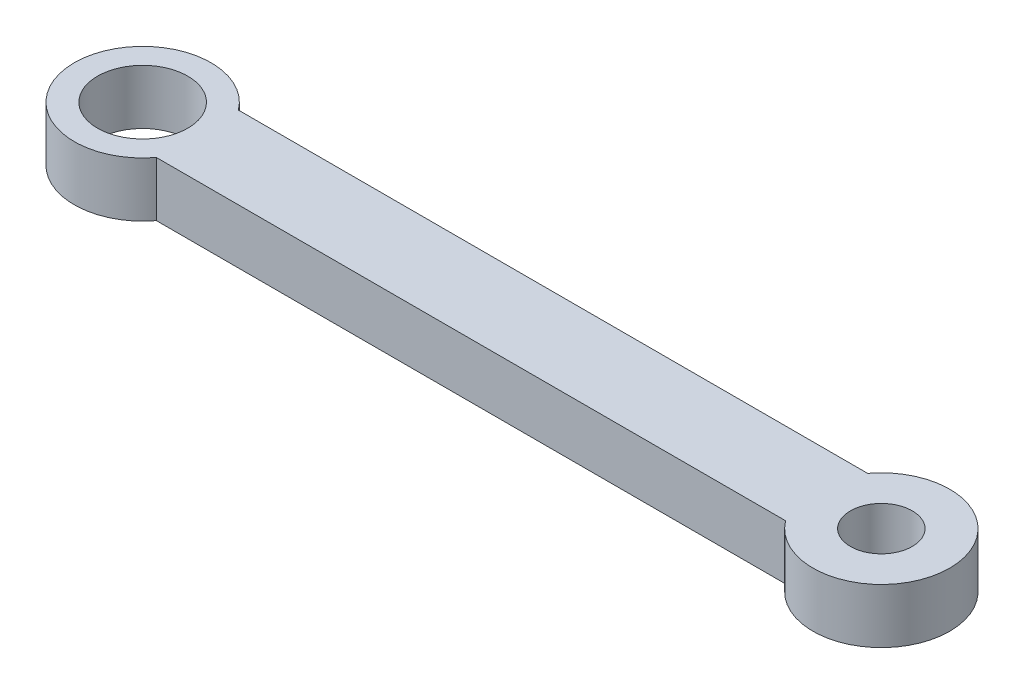
ISO-10303-21;
HEADER;
FILE_DESCRIPTION(('STEP AP214'),'2;1');
FILE_NAME('part.step','',(''),(''),'','','');
FILE_SCHEMA(('AUTOMOTIVE_DESIGN { 1 0 10303 214 1 1 1 1 }'));
ENDSEC;
DATA;
#1=APPLICATION_CONTEXT('core data for automotive mechanical design processes');
#2=APPLICATION_PROTOCOL_DEFINITION('international standard','automotive_design',2000,#1);
#3=PRODUCT_CONTEXT('',#1,'mechanical');
#4=PRODUCT('Part','Part','',(#3));
#5=PRODUCT_RELATED_PRODUCT_CATEGORY('part','',(#4));
#6=PRODUCT_DEFINITION_FORMATION('','',#4);
#7=PRODUCT_DEFINITION_CONTEXT('part definition',#1,'design');
#8=PRODUCT_DEFINITION('design','',#6,#7);
#9=PRODUCT_DEFINITION_SHAPE('','',#8);
#10=(LENGTH_UNIT() NAMED_UNIT(*) SI_UNIT(.MILLI.,.METRE.));
#11=(NAMED_UNIT(*) PLANE_ANGLE_UNIT() SI_UNIT($,.RADIAN.));
#12=(NAMED_UNIT(*) SI_UNIT($,.STERADIAN.) SOLID_ANGLE_UNIT());
#13=UNCERTAINTY_MEASURE_WITH_UNIT(LENGTH_MEASURE(1.E-05),#10,'distance_accuracy_value','');
#14=(GEOMETRIC_REPRESENTATION_CONTEXT(3) GLOBAL_UNCERTAINTY_ASSIGNED_CONTEXT((#13)) GLOBAL_UNIT_ASSIGNED_CONTEXT((#10,
#11,#12)) REPRESENTATION_CONTEXT('',''));
#15=CARTESIAN_POINT('',(0.,0.,0.));
#16=DIRECTION('',(0.,0.,1.));
#17=DIRECTION('',(1.,0.,0.));
#18=AXIS2_PLACEMENT_3D('',#15,#16,#17);
#19=CARTESIAN_POINT('',(-13.5,2.,0.));
#20=DIRECTION('',(0.,1.,0.));
#21=DIRECTION('',(0.,0.,1.));
#22=AXIS2_PLACEMENT_3D('',#19,#20,#21);
#23=PLANE('',#22);
#24=CARTESIAN_POINT('',(-13.5,2.,0.));
#25=DIRECTION('',(0.,1.,0.));
#26=DIRECTION('',(0.,0.,1.));
#27=AXIS2_PLACEMENT_3D('',#24,#25,#26);
#28=CIRCLE('',#27,1.65);
#29=CARTESIAN_POINT('',(-13.5,2.,1.65));
#30=VERTEX_POINT('',#29);
#31=EDGE_CURVE('E100',#30,#30,#28,.T.);
#32=ORIENTED_EDGE('',*,*,#31,.F.);
#33=EDGE_LOOP('',(#32));
#34=FACE_BOUND('',#33,.T.);
#35=CARTESIAN_POINT('',(-13.5,2.,0.));
#36=DIRECTION('',(0.,1.,0.));
#37=DIRECTION('',(0.,0.,1.));
#38=AXIS2_PLACEMENT_3D('',#35,#36,#37);
#39=CIRCLE('',#38,2.5);
#40=CARTESIAN_POINT('',(-11.5,2.,-1.5));
#41=VERTEX_POINT('',#40);
#42=CARTESIAN_POINT('',(-11.5,2.,1.5));
#43=VERTEX_POINT('',#42);
#44=EDGE_CURVE('E85',#41,#43,#39,.T.);
#45=ORIENTED_EDGE('',*,*,#44,.T.);
#46=DIRECTION('',(1.,0.,0.));
#47=VECTOR('',#46,1.);
#48=CARTESIAN_POINT('',(-11.5,2.,1.5));
#49=LINE('',#48,#47);
#50=CARTESIAN_POINT('',(11.5,2.,1.5));
#51=VERTEX_POINT('',#50);
#52=EDGE_CURVE('E80',#43,#51,#49,.T.);
#53=ORIENTED_EDGE('',*,*,#52,.T.);
#54=CARTESIAN_POINT('',(13.5,2.,0.));
#55=DIRECTION('',(0.,1.,0.));
#56=DIRECTION('',(0.,0.,-1.));
#57=AXIS2_PLACEMENT_3D('',#54,#55,#56);
#58=CIRCLE('',#57,2.5);
#59=CARTESIAN_POINT('',(11.5,2.,-1.50000000000001));
#60=VERTEX_POINT('',#59);
#61=EDGE_CURVE('E83',#51,#60,#58,.T.);
#62=ORIENTED_EDGE('',*,*,#61,.T.);
#63=DIRECTION('',(-1.,0.,0.));
#64=VECTOR('',#63,1.);
#65=CARTESIAN_POINT('',(-11.5,2.,-1.5));
#66=LINE('',#65,#64);
#67=EDGE_CURVE('E50',#60,#41,#66,.T.);
#68=ORIENTED_EDGE('',*,*,#67,.T.);
#69=EDGE_LOOP('',(#45,#53,#62,#68));
#70=FACE_BOUND('',#69,.T.);
#71=CARTESIAN_POINT('',(13.5,2.,0.));
#72=DIRECTION('',(0.,1.,0.));
#73=DIRECTION('',(0.,0.,1.));
#74=AXIS2_PLACEMENT_3D('',#71,#72,#73);
#75=CIRCLE('',#74,1.1303);
#76=CARTESIAN_POINT('',(13.5,2.,1.1303));
#77=VERTEX_POINT('',#76);
#78=EDGE_CURVE('E115',#77,#77,#75,.T.);
#79=ORIENTED_EDGE('',*,*,#78,.F.);
#80=EDGE_LOOP('',(#79));
#81=FACE_BOUND('',#80,.T.);
#82=ADVANCED_FACE('F33',(#34,#70,#81),#23,.T.);
#83=CARTESIAN_POINT('',(-13.5,0.,0.));
#84=DIRECTION('',(0.,1.,0.));
#85=DIRECTION('',(0.,0.,1.));
#86=AXIS2_PLACEMENT_3D('',#83,#84,#85);
#87=PLANE('',#86);
#88=CARTESIAN_POINT('',(-13.5,0.,0.));
#89=DIRECTION('',(0.,1.,0.));
#90=DIRECTION('',(0.,0.,1.));
#91=AXIS2_PLACEMENT_3D('',#88,#89,#90);
#92=CIRCLE('',#91,2.5);
#93=CARTESIAN_POINT('',(-11.5,0.,-1.5));
#94=VERTEX_POINT('',#93);
#95=CARTESIAN_POINT('',(-11.5,0.,1.5));
#96=VERTEX_POINT('',#95);
#97=EDGE_CURVE('E97',#94,#96,#92,.T.);
#98=ORIENTED_EDGE('',*,*,#97,.F.);
#99=DIRECTION('',(-1.,0.,0.));
#100=VECTOR('',#99,1.);
#101=CARTESIAN_POINT('',(-11.5,0.,-1.5));
#102=LINE('',#101,#100);
#103=CARTESIAN_POINT('',(11.5,0.,-1.50000000000001));
#104=VERTEX_POINT('',#103);
#105=EDGE_CURVE('E73',#104,#94,#102,.T.);
#106=ORIENTED_EDGE('',*,*,#105,.F.);
#107=CARTESIAN_POINT('',(13.5,0.,0.));
#108=DIRECTION('',(0.,1.,0.));
#109=DIRECTION('',(0.,0.,-1.));
#110=AXIS2_PLACEMENT_3D('',#107,#108,#109);
#111=CIRCLE('',#110,2.5);
#112=CARTESIAN_POINT('',(11.5,0.,1.5));
#113=VERTEX_POINT('',#112);
#114=EDGE_CURVE('E67',#113,#104,#111,.T.);
#115=ORIENTED_EDGE('',*,*,#114,.F.);
#116=DIRECTION('',(1.,0.,0.));
#117=VECTOR('',#116,1.);
#118=CARTESIAN_POINT('',(-11.5,0.,1.5));
#119=LINE('',#118,#117);
#120=EDGE_CURVE('E89',#96,#113,#119,.T.);
#121=ORIENTED_EDGE('',*,*,#120,.F.);
#122=EDGE_LOOP('',(#98,#106,#115,#121));
#123=FACE_BOUND('',#122,.T.);
#124=CARTESIAN_POINT('',(-13.5,0.,0.));
#125=DIRECTION('',(0.,1.,0.));
#126=DIRECTION('',(0.,0.,1.));
#127=AXIS2_PLACEMENT_3D('',#124,#125,#126);
#128=CIRCLE('',#127,1.65);
#129=CARTESIAN_POINT('',(-13.5,0.,1.65));
#130=VERTEX_POINT('',#129);
#131=EDGE_CURVE('E112',#130,#130,#128,.T.);
#132=ORIENTED_EDGE('',*,*,#131,.T.);
#133=EDGE_LOOP('',(#132));
#134=FACE_BOUND('',#133,.T.);
#135=CARTESIAN_POINT('',(13.5,0.,0.));
#136=DIRECTION('',(0.,1.,0.));
#137=DIRECTION('',(0.,0.,1.));
#138=AXIS2_PLACEMENT_3D('',#135,#136,#137);
#139=CIRCLE('',#138,1.1303);
#140=CARTESIAN_POINT('',(13.5,0.,1.1303));
#141=VERTEX_POINT('',#140);
#142=EDGE_CURVE('E118',#141,#141,#139,.T.);
#143=ORIENTED_EDGE('',*,*,#142,.T.);
#144=EDGE_LOOP('',(#143));
#145=FACE_BOUND('',#144,.T.);
#146=ADVANCED_FACE('F108',(#123,#134,#145),#87,.F.);
#147=CARTESIAN_POINT('',(-13.5,2.,0.));
#148=DIRECTION('',(0.,-1.,0.));
#149=DIRECTION('',(0.,0.,-1.));
#150=AXIS2_PLACEMENT_3D('',#147,#148,#149);
#151=CYLINDRICAL_SURFACE('',#150,2.5);
#152=ORIENTED_EDGE('',*,*,#97,.T.);
#153=DIRECTION('',(0.,-1.,0.));
#154=VECTOR('',#153,1.);
#155=CARTESIAN_POINT('',(-11.5,2.,1.5));
#156=LINE('',#155,#154);
#157=EDGE_CURVE('E11',#43,#96,#156,.T.);
#158=ORIENTED_EDGE('',*,*,#157,.F.);
#159=ORIENTED_EDGE('',*,*,#44,.F.);
#160=DIRECTION('',(0.,-1.,0.));
#161=VECTOR('',#160,1.);
#162=CARTESIAN_POINT('',(-11.5,2.,-1.5));
#163=LINE('',#162,#161);
#164=EDGE_CURVE('E93',#41,#94,#163,.T.);
#165=ORIENTED_EDGE('',*,*,#164,.T.);
#166=EDGE_LOOP('',(#152,#158,#159,#165));
#167=FACE_BOUND('',#166,.T.);
#168=ADVANCED_FACE('F35',(#167),#151,.T.);
#169=CARTESIAN_POINT('',(-11.5,2.,1.5));
#170=DIRECTION('',(0.,0.,-1.));
#171=DIRECTION('',(-1.,0.,0.));
#172=AXIS2_PLACEMENT_3D('',#169,#170,#171);
#173=PLANE('',#172);
#174=ORIENTED_EDGE('',*,*,#120,.T.);
#175=DIRECTION('',(0.,-1.,0.));
#176=VECTOR('',#175,1.);
#177=CARTESIAN_POINT('',(11.5,2.,1.5));
#178=LINE('',#177,#176);
#179=EDGE_CURVE('E42',#51,#113,#178,.T.);
#180=ORIENTED_EDGE('',*,*,#179,.F.);
#181=ORIENTED_EDGE('',*,*,#52,.F.);
#182=ORIENTED_EDGE('',*,*,#157,.T.);
#183=EDGE_LOOP('',(#174,#180,#181,#182));
#184=FACE_BOUND('',#183,.T.);
#185=ADVANCED_FACE('F88',(#184),#173,.F.);
#186=CARTESIAN_POINT('',(13.5,2.,0.));
#187=DIRECTION('',(0.,-1.,0.));
#188=DIRECTION('',(0.,0.,-1.));
#189=AXIS2_PLACEMENT_3D('',#186,#187,#188);
#190=CYLINDRICAL_SURFACE('',#189,2.5);
#191=ORIENTED_EDGE('',*,*,#114,.T.);
#192=DIRECTION('',(0.,-1.,0.));
#193=VECTOR('',#192,1.);
#194=CARTESIAN_POINT('',(11.5,2.,-1.50000000000001));
#195=LINE('',#194,#193);
#196=EDGE_CURVE('E90',#60,#104,#195,.T.);
#197=ORIENTED_EDGE('',*,*,#196,.F.);
#198=ORIENTED_EDGE('',*,*,#61,.F.);
#199=ORIENTED_EDGE('',*,*,#179,.T.);
#200=EDGE_LOOP('',(#191,#197,#198,#199));
#201=FACE_BOUND('',#200,.T.);
#202=ADVANCED_FACE('F91',(#201),#190,.T.);
#203=CARTESIAN_POINT('',(-11.5,2.,-1.5));
#204=DIRECTION('',(0.,0.,1.));
#205=DIRECTION('',(1.,0.,0.));
#206=AXIS2_PLACEMENT_3D('',#203,#204,#205);
#207=PLANE('',#206);
#208=ORIENTED_EDGE('',*,*,#105,.T.);
#209=ORIENTED_EDGE('',*,*,#164,.F.);
#210=ORIENTED_EDGE('',*,*,#67,.F.);
#211=ORIENTED_EDGE('',*,*,#196,.T.);
#212=EDGE_LOOP('',(#208,#209,#210,#211));
#213=FACE_BOUND('',#212,.T.);
#214=ADVANCED_FACE('F105',(#213),#207,.F.);
#215=CARTESIAN_POINT('',(-13.5,2.,0.));
#216=DIRECTION('',(0.,-1.,0.));
#217=DIRECTION('',(0.,0.,-1.));
#218=AXIS2_PLACEMENT_3D('',#215,#216,#217);
#219=CYLINDRICAL_SURFACE('',#218,1.65);
#220=ORIENTED_EDGE('',*,*,#31,.T.);
#221=EDGE_LOOP('',(#220));
#222=FACE_BOUND('',#221,.T.);
#223=ORIENTED_EDGE('',*,*,#131,.F.);
#224=EDGE_LOOP('',(#223));
#225=FACE_BOUND('',#224,.T.);
#226=ADVANCED_FACE('F135',(#222,#225),#219,.F.);
#227=CARTESIAN_POINT('',(13.5,2.,0.));
#228=DIRECTION('',(0.,-1.,0.));
#229=DIRECTION('',(0.,0.,-1.));
#230=AXIS2_PLACEMENT_3D('',#227,#228,#229);
#231=CYLINDRICAL_SURFACE('',#230,1.1303);
#232=ORIENTED_EDGE('',*,*,#78,.T.);
#233=EDGE_LOOP('',(#232));
#234=FACE_BOUND('',#233,.T.);
#235=ORIENTED_EDGE('',*,*,#142,.F.);
#236=EDGE_LOOP('',(#235));
#237=FACE_BOUND('',#236,.T.);
#238=ADVANCED_FACE('F124',(#234,#237),#231,.F.);
#239=CLOSED_SHELL('',(#82,#146,#168,#185,#202,#214,#226,#238));
#240=MANIFOLD_SOLID_BREP('B2',#239);
#241=ADVANCED_BREP_SHAPE_REPRESENTATION('',(#18,#240),#14);
#242=SHAPE_DEFINITION_REPRESENTATION(#9,#241);
ENDSEC;
END-ISO-10303-21;
